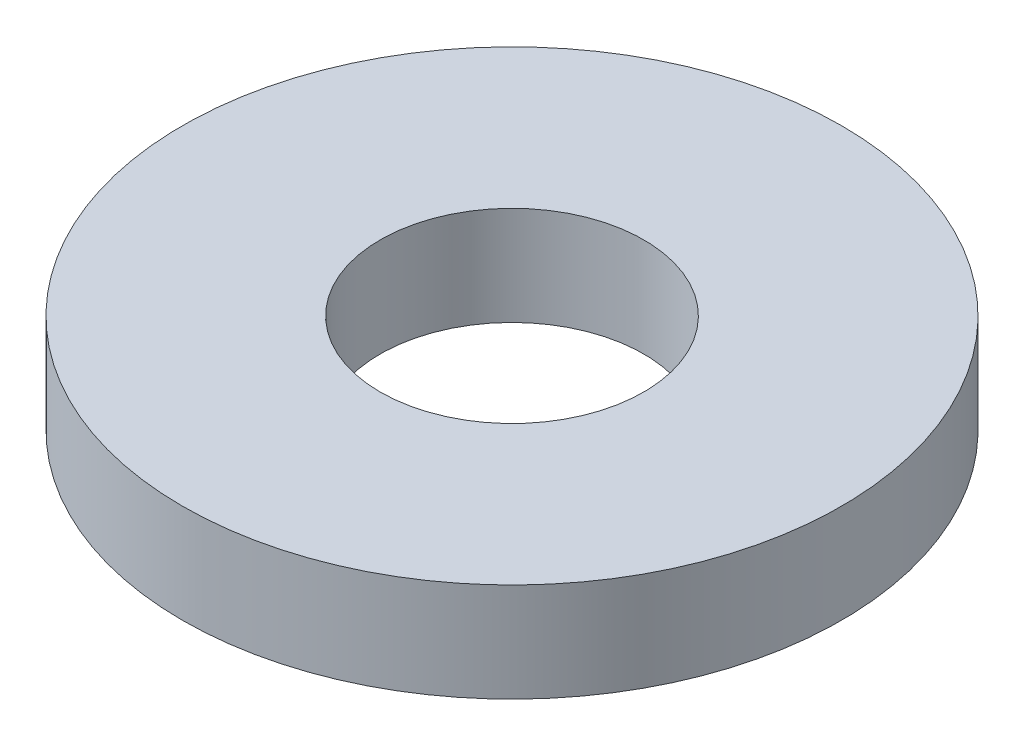
ISO-10303-21;
HEADER;
FILE_DESCRIPTION(('STEP AP214'),'2;1');
FILE_NAME('part.step','',(''),(''),'','','');
FILE_SCHEMA(('AUTOMOTIVE_DESIGN { 1 0 10303 214 1 1 1 1 }'));
ENDSEC;
DATA;
#1=APPLICATION_CONTEXT('core data for automotive mechanical design processes');
#2=APPLICATION_PROTOCOL_DEFINITION('international standard','automotive_design',2000,#1);
#3=PRODUCT_CONTEXT('',#1,'mechanical');
#4=PRODUCT('Part','Part','',(#3));
#5=PRODUCT_RELATED_PRODUCT_CATEGORY('part','',(#4));
#6=PRODUCT_DEFINITION_FORMATION('','',#4);
#7=PRODUCT_DEFINITION_CONTEXT('part definition',#1,'design');
#8=PRODUCT_DEFINITION('design','',#6,#7);
#9=PRODUCT_DEFINITION_SHAPE('','',#8);
#10=(LENGTH_UNIT() NAMED_UNIT(*) SI_UNIT(.MILLI.,.METRE.));
#11=(NAMED_UNIT(*) PLANE_ANGLE_UNIT() SI_UNIT($,.RADIAN.));
#12=(NAMED_UNIT(*) SI_UNIT($,.STERADIAN.) SOLID_ANGLE_UNIT());
#13=UNCERTAINTY_MEASURE_WITH_UNIT(LENGTH_MEASURE(1.E-05),#10,'distance_accuracy_value','');
#14=(GEOMETRIC_REPRESENTATION_CONTEXT(3) GLOBAL_UNCERTAINTY_ASSIGNED_CONTEXT((#13)) GLOBAL_UNIT_ASSIGNED_CONTEXT((#10,
#11,#12)) REPRESENTATION_CONTEXT('',''));
#15=CARTESIAN_POINT('',(0.,0.,0.));
#16=DIRECTION('',(0.,0.,1.));
#17=DIRECTION('',(1.,0.,0.));
#18=AXIS2_PLACEMENT_3D('',#15,#16,#17);
#19=CARTESIAN_POINT('',(0.,3.,0.));
#20=DIRECTION('',(0.,1.,0.));
#21=DIRECTION('',(0.,0.,1.));
#22=AXIS2_PLACEMENT_3D('',#19,#20,#21);
#23=PLANE('',#22);
#24=CARTESIAN_POINT('',(0.,3.,0.));
#25=DIRECTION('',(0.,1.,0.));
#26=DIRECTION('',(0.,0.,1.));
#27=AXIS2_PLACEMENT_3D('',#24,#25,#26);
#28=CIRCLE('',#27,10.);
#29=CARTESIAN_POINT('',(0.,3.,10.));
#30=VERTEX_POINT('',#29);
#31=EDGE_CURVE('E10',#30,#30,#28,.T.);
#32=ORIENTED_EDGE('',*,*,#31,.T.);
#33=EDGE_LOOP('',(#32));
#34=FACE_BOUND('',#33,.T.);
#35=CARTESIAN_POINT('',(0.,3.,0.));
#36=DIRECTION('',(0.,1.,0.));
#37=DIRECTION('',(0.,0.,1.));
#38=AXIS2_PLACEMENT_3D('',#35,#36,#37);
#39=CIRCLE('',#38,4.);
#40=CARTESIAN_POINT('',(0.,3.,4.));
#41=VERTEX_POINT('',#40);
#42=EDGE_CURVE('E41',#41,#41,#39,.T.);
#43=ORIENTED_EDGE('',*,*,#42,.F.);
#44=EDGE_LOOP('',(#43));
#45=FACE_BOUND('',#44,.T.);
#46=ADVANCED_FACE('F30',(#34,#45),#23,.T.);
#47=CARTESIAN_POINT('',(0.,0.,0.));
#48=DIRECTION('',(0.,1.,0.));
#49=DIRECTION('',(0.,0.,1.));
#50=AXIS2_PLACEMENT_3D('',#47,#48,#49);
#51=PLANE('',#50);
#52=CARTESIAN_POINT('',(0.,0.,0.));
#53=DIRECTION('',(0.,1.,0.));
#54=DIRECTION('',(0.,0.,1.));
#55=AXIS2_PLACEMENT_3D('',#52,#53,#54);
#56=CIRCLE('',#55,10.);
#57=CARTESIAN_POINT('',(0.,0.,10.));
#58=VERTEX_POINT('',#57);
#59=EDGE_CURVE('E34',#58,#58,#56,.T.);
#60=ORIENTED_EDGE('',*,*,#59,.F.);
#61=EDGE_LOOP('',(#60));
#62=FACE_BOUND('',#61,.T.);
#63=CARTESIAN_POINT('',(0.,0.,0.));
#64=DIRECTION('',(0.,1.,0.));
#65=DIRECTION('',(0.,0.,1.));
#66=AXIS2_PLACEMENT_3D('',#63,#64,#65);
#67=CIRCLE('',#66,4.);
#68=CARTESIAN_POINT('',(0.,0.,4.));
#69=VERTEX_POINT('',#68);
#70=EDGE_CURVE('E43',#69,#69,#67,.T.);
#71=ORIENTED_EDGE('',*,*,#70,.T.);
#72=EDGE_LOOP('',(#71));
#73=FACE_BOUND('',#72,.T.);
#74=ADVANCED_FACE('F53',(#62,#73),#51,.F.);
#75=CARTESIAN_POINT('',(0.,3.,0.));
#76=DIRECTION('',(0.,-1.,0.));
#77=DIRECTION('',(0.,0.,-1.));
#78=AXIS2_PLACEMENT_3D('',#75,#76,#77);
#79=CYLINDRICAL_SURFACE('',#78,10.);
#80=ORIENTED_EDGE('',*,*,#31,.F.);
#81=EDGE_LOOP('',(#80));
#82=FACE_BOUND('',#81,.T.);
#83=ORIENTED_EDGE('',*,*,#59,.T.);
#84=EDGE_LOOP('',(#83));
#85=FACE_BOUND('',#84,.T.);
#86=ADVANCED_FACE('F32',(#82,#85),#79,.T.);
#87=CARTESIAN_POINT('',(0.,3.,0.));
#88=DIRECTION('',(0.,-1.,0.));
#89=DIRECTION('',(0.,0.,-1.));
#90=AXIS2_PLACEMENT_3D('',#87,#88,#89);
#91=CYLINDRICAL_SURFACE('',#90,4.);
#92=ORIENTED_EDGE('',*,*,#42,.T.);
#93=EDGE_LOOP('',(#92));
#94=FACE_BOUND('',#93,.T.);
#95=ORIENTED_EDGE('',*,*,#70,.F.);
#96=EDGE_LOOP('',(#95));
#97=FACE_BOUND('',#96,.T.);
#98=ADVANCED_FACE('F49',(#94,#97),#91,.F.);
#99=CLOSED_SHELL('',(#46,#74,#86,#98));
#100=MANIFOLD_SOLID_BREP('B2',#99);
#101=ADVANCED_BREP_SHAPE_REPRESENTATION('',(#18,#100),#14);
#102=SHAPE_DEFINITION_REPRESENTATION(#9,#101);
ENDSEC;
END-ISO-10303-21;
